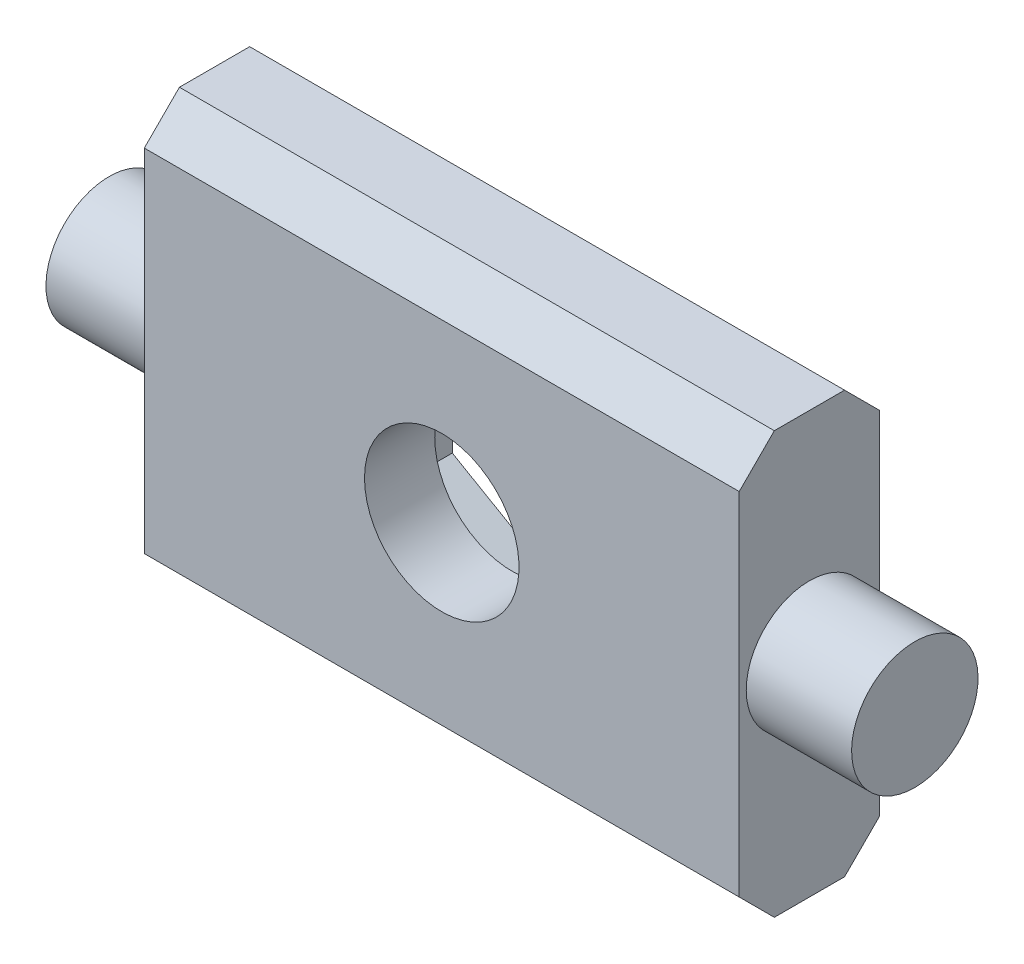
ISO-10303-21;
HEADER;
FILE_DESCRIPTION(('STEP AP214'),'2;1');
FILE_NAME('part.step','',(''),(''),'','','');
FILE_SCHEMA(('AUTOMOTIVE_DESIGN { 1 0 10303 214 1 1 1 1 }'));
ENDSEC;
DATA;
#1=APPLICATION_CONTEXT('core data for automotive mechanical design processes');
#2=APPLICATION_PROTOCOL_DEFINITION('international standard','automotive_design',2000,#1);
#3=PRODUCT_CONTEXT('',#1,'mechanical');
#4=PRODUCT('Part','Part','',(#3));
#5=PRODUCT_RELATED_PRODUCT_CATEGORY('part','',(#4));
#6=PRODUCT_DEFINITION_FORMATION('','',#4);
#7=PRODUCT_DEFINITION_CONTEXT('part definition',#1,'design');
#8=PRODUCT_DEFINITION('design','',#6,#7);
#9=PRODUCT_DEFINITION_SHAPE('','',#8);
#10=(LENGTH_UNIT() NAMED_UNIT(*) SI_UNIT(.MILLI.,.METRE.));
#11=(NAMED_UNIT(*) PLANE_ANGLE_UNIT() SI_UNIT($,.RADIAN.));
#12=(NAMED_UNIT(*) SI_UNIT($,.STERADIAN.) SOLID_ANGLE_UNIT());
#13=UNCERTAINTY_MEASURE_WITH_UNIT(LENGTH_MEASURE(1.E-05),#10,'distance_accuracy_value','');
#14=(GEOMETRIC_REPRESENTATION_CONTEXT(3) GLOBAL_UNCERTAINTY_ASSIGNED_CONTEXT((#13)) GLOBAL_UNIT_ASSIGNED_CONTEXT((#10,
#11,#12)) REPRESENTATION_CONTEXT('',''));
#15=CARTESIAN_POINT('',(0.,0.,0.));
#16=DIRECTION('',(0.,0.,1.));
#17=DIRECTION('',(1.,0.,0.));
#18=AXIS2_PLACEMENT_3D('',#15,#16,#17);
#19=CARTESIAN_POINT('',(0.,0.,4.));
#20=DIRECTION('',(0.,0.,1.));
#21=DIRECTION('',(1.,0.,0.));
#22=AXIS2_PLACEMENT_3D('',#19,#20,#21);
#23=PLANE('',#22);
#24=CARTESIAN_POINT('',(0.,0.,4.));
#25=DIRECTION('',(0.,0.,-1.));
#26=DIRECTION('',(-1.,0.,0.));
#27=AXIS2_PLACEMENT_3D('',#24,#25,#26);
#28=CIRCLE('',#27,2.2);
#29=CARTESIAN_POINT('',(-2.2,0.,4.));
#30=VERTEX_POINT('',#29);
#31=EDGE_CURVE('E231',#30,#30,#28,.T.);
#32=ORIENTED_EDGE('',*,*,#31,.T.);
#33=EDGE_LOOP('',(#32));
#34=FACE_BOUND('',#33,.T.);
#35=DIRECTION('',(0.,1.,0.));
#36=VECTOR('',#35,1.);
#37=CARTESIAN_POINT('',(-8.47,0.,4.));
#38=LINE('',#37,#36);
#39=CARTESIAN_POINT('',(-8.47,-5.,4.));
#40=VERTEX_POINT('',#39);
#41=CARTESIAN_POINT('',(-8.47,5.,4.));
#42=VERTEX_POINT('',#41);
#43=EDGE_CURVE('E251',#40,#42,#38,.T.);
#44=ORIENTED_EDGE('',*,*,#43,.F.);
#45=DIRECTION('',(1.,0.,0.));
#46=VECTOR('',#45,1.);
#47=CARTESIAN_POINT('',(8.47000000000001,-5.,4.));
#48=LINE('',#47,#46);
#49=CARTESIAN_POINT('',(8.47,-5.,4.));
#50=VERTEX_POINT('',#49);
#51=EDGE_CURVE('E280',#40,#50,#48,.T.);
#52=ORIENTED_EDGE('',*,*,#51,.T.);
#53=DIRECTION('',(0.,-1.,0.));
#54=VECTOR('',#53,1.);
#55=CARTESIAN_POINT('',(8.47,0.,4.));
#56=LINE('',#55,#54);
#57=CARTESIAN_POINT('',(8.47,5.,4.));
#58=VERTEX_POINT('',#57);
#59=EDGE_CURVE('E259',#58,#50,#56,.T.);
#60=ORIENTED_EDGE('',*,*,#59,.F.);
#61=DIRECTION('',(-1.,0.,0.));
#62=VECTOR('',#61,1.);
#63=CARTESIAN_POINT('',(-8.47,5.,4.));
#64=LINE('',#63,#62);
#65=EDGE_CURVE('E277',#58,#42,#64,.T.);
#66=ORIENTED_EDGE('',*,*,#65,.T.);
#67=EDGE_LOOP('',(#44,#52,#60,#66));
#68=FACE_BOUND('',#67,.T.);
#69=ADVANCED_FACE('F82',(#34,#68),#23,.T.);
#70=CARTESIAN_POINT('',(0.,0.,0.));
#71=DIRECTION('',(0.,0.,1.));
#72=DIRECTION('',(1.,0.,0.));
#73=AXIS2_PLACEMENT_3D('',#70,#71,#72);
#74=PLANE('',#73);
#75=DIRECTION('',(-0.866025403784438,0.5,0.));
#76=VECTOR('',#75,1.);
#77=CARTESIAN_POINT('',(0.,-4.27239199200323,0.));
#78=LINE('',#77,#76);
#79=CARTESIAN_POINT('',(0.,-4.27239199200323,0.));
#80=VERTEX_POINT('',#79);
#81=CARTESIAN_POINT('',(-3.7,-2.13619599600161,0.));
#82=VERTEX_POINT('',#81);
#83=EDGE_CURVE('E202',#80,#82,#78,.T.);
#84=ORIENTED_EDGE('',*,*,#83,.F.);
#85=DIRECTION('',(-0.866025403784439,-0.5,0.));
#86=VECTOR('',#85,1.);
#87=CARTESIAN_POINT('',(3.7,-2.13619599600161,0.));
#88=LINE('',#87,#86);
#89=CARTESIAN_POINT('',(3.7,-2.13619599600161,0.));
#90=VERTEX_POINT('',#89);
#91=EDGE_CURVE('E99',#90,#80,#88,.T.);
#92=ORIENTED_EDGE('',*,*,#91,.F.);
#93=DIRECTION('',(0.,-1.,0.));
#94=VECTOR('',#93,1.);
#95=CARTESIAN_POINT('',(3.7,2.13619599600162,0.));
#96=LINE('',#95,#94);
#97=CARTESIAN_POINT('',(3.7,2.13619599600162,0.));
#98=VERTEX_POINT('',#97);
#99=EDGE_CURVE('E218',#98,#90,#96,.T.);
#100=ORIENTED_EDGE('',*,*,#99,.F.);
#101=DIRECTION('',(0.866025403784439,-0.5,0.));
#102=VECTOR('',#101,1.);
#103=CARTESIAN_POINT('',(0.,4.27239199200323,0.));
#104=LINE('',#103,#102);
#105=CARTESIAN_POINT('',(0.,4.27239199200323,0.));
#106=VERTEX_POINT('',#105);
#107=EDGE_CURVE('E212',#106,#98,#104,.T.);
#108=ORIENTED_EDGE('',*,*,#107,.F.);
#109=DIRECTION('',(0.866025403784439,0.5,0.));
#110=VECTOR('',#109,1.);
#111=CARTESIAN_POINT('',(-3.7,2.13619599600162,0.));
#112=LINE('',#111,#110);
#113=CARTESIAN_POINT('',(-3.7,2.13619599600162,0.));
#114=VERTEX_POINT('',#113);
#115=EDGE_CURVE('E210',#114,#106,#112,.T.);
#116=ORIENTED_EDGE('',*,*,#115,.F.);
#117=DIRECTION('',(0.,1.,0.));
#118=VECTOR('',#117,1.);
#119=CARTESIAN_POINT('',(-3.7,-2.13619599600161,0.));
#120=LINE('',#119,#118);
#121=EDGE_CURVE('E192',#82,#114,#120,.T.);
#122=ORIENTED_EDGE('',*,*,#121,.F.);
#123=EDGE_LOOP('',(#84,#92,#100,#108,#116,#122));
#124=FACE_BOUND('',#123,.T.);
#125=DIRECTION('',(0.,1.,0.));
#126=VECTOR('',#125,1.);
#127=CARTESIAN_POINT('',(8.47,0.,0.));
#128=LINE('',#127,#126);
#129=CARTESIAN_POINT('',(8.47,-4.99999999999999,0.));
#130=VERTEX_POINT('',#129);
#131=CARTESIAN_POINT('',(8.47,5.,0.));
#132=VERTEX_POINT('',#131);
#133=EDGE_CURVE('E262',#130,#132,#128,.T.);
#134=ORIENTED_EDGE('',*,*,#133,.F.);
#135=DIRECTION('',(-1.,0.,0.));
#136=VECTOR('',#135,1.);
#137=CARTESIAN_POINT('',(0.,-4.99999999999999,0.));
#138=LINE('',#137,#136);
#139=CARTESIAN_POINT('',(-8.47,-4.99999999999999,0.));
#140=VERTEX_POINT('',#139);
#141=EDGE_CURVE('E298',#130,#140,#138,.T.);
#142=ORIENTED_EDGE('',*,*,#141,.T.);
#143=DIRECTION('',(0.,-1.,0.));
#144=VECTOR('',#143,1.);
#145=CARTESIAN_POINT('',(-8.47,0.,0.));
#146=LINE('',#145,#144);
#147=CARTESIAN_POINT('',(-8.47,5.,0.));
#148=VERTEX_POINT('',#147);
#149=EDGE_CURVE('E248',#148,#140,#146,.T.);
#150=ORIENTED_EDGE('',*,*,#149,.F.);
#151=DIRECTION('',(1.,0.,0.));
#152=VECTOR('',#151,1.);
#153=CARTESIAN_POINT('',(0.,5.,0.));
#154=LINE('',#153,#152);
#155=EDGE_CURVE('E273',#148,#132,#154,.T.);
#156=ORIENTED_EDGE('',*,*,#155,.T.);
#157=EDGE_LOOP('',(#134,#142,#150,#156));
#158=FACE_BOUND('',#157,.T.);
#159=ADVANCED_FACE('F206',(#124,#158),#74,.F.);
#160=CARTESIAN_POINT('',(-11.47,-6.,4.));
#161=DIRECTION('',(0.,1.,0.));
#162=DIRECTION('',(0.,0.,1.));
#163=AXIS2_PLACEMENT_3D('',#160,#161,#162);
#164=PLANE('',#163);
#165=DIRECTION('',(0.,0.,-1.));
#166=VECTOR('',#165,1.);
#167=CARTESIAN_POINT('',(8.47000000000001,-6.,0.));
#168=LINE('',#167,#166);
#169=CARTESIAN_POINT('',(8.47000000000001,-6.,2.99999999999999));
#170=VERTEX_POINT('',#169);
#171=CARTESIAN_POINT('',(8.47000000000001,-6.,1.));
#172=VERTEX_POINT('',#171);
#173=EDGE_CURVE('E256',#170,#172,#168,.T.);
#174=ORIENTED_EDGE('',*,*,#173,.F.);
#175=DIRECTION('',(-1.,0.,0.));
#176=VECTOR('',#175,1.);
#177=CARTESIAN_POINT('',(-8.47,-6.,2.99999999999999));
#178=LINE('',#177,#176);
#179=CARTESIAN_POINT('',(-8.47,-6.,2.99999999999999));
#180=VERTEX_POINT('',#179);
#181=EDGE_CURVE('E291',#170,#180,#178,.T.);
#182=ORIENTED_EDGE('',*,*,#181,.T.);
#183=DIRECTION('',(0.,0.,1.));
#184=VECTOR('',#183,1.);
#185=CARTESIAN_POINT('',(-8.47,-6.,0.));
#186=LINE('',#185,#184);
#187=CARTESIAN_POINT('',(-8.47,-6.,1.));
#188=VERTEX_POINT('',#187);
#189=EDGE_CURVE('E245',#188,#180,#186,.T.);
#190=ORIENTED_EDGE('',*,*,#189,.F.);
#191=DIRECTION('',(1.,0.,0.));
#192=VECTOR('',#191,1.);
#193=CARTESIAN_POINT('',(-11.47,-6.,1.));
#194=LINE('',#193,#192);
#195=EDGE_CURVE('E288',#188,#172,#194,.T.);
#196=ORIENTED_EDGE('',*,*,#195,.T.);
#197=EDGE_LOOP('',(#174,#182,#190,#196));
#198=FACE_BOUND('',#197,.T.);
#199=ADVANCED_FACE('F331',(#198),#164,.F.);
#200=CARTESIAN_POINT('',(-11.47,6.,4.));
#201=DIRECTION('',(0.,-1.,0.));
#202=DIRECTION('',(0.,0.,-1.));
#203=AXIS2_PLACEMENT_3D('',#200,#201,#202);
#204=PLANE('',#203);
#205=DIRECTION('',(0.,0.,-1.));
#206=VECTOR('',#205,1.);
#207=CARTESIAN_POINT('',(-8.47,6.,0.));
#208=LINE('',#207,#206);
#209=CARTESIAN_POINT('',(-8.47,6.,2.99999999999999));
#210=VERTEX_POINT('',#209);
#211=CARTESIAN_POINT('',(-8.47,6.,0.999999999999995));
#212=VERTEX_POINT('',#211);
#213=EDGE_CURVE('E254',#210,#212,#208,.T.);
#214=ORIENTED_EDGE('',*,*,#213,.F.);
#215=DIRECTION('',(1.,0.,0.));
#216=VECTOR('',#215,1.);
#217=CARTESIAN_POINT('',(8.47,6.,2.99999999999999));
#218=LINE('',#217,#216);
#219=CARTESIAN_POINT('',(8.47,6.,2.99999999999999));
#220=VERTEX_POINT('',#219);
#221=EDGE_CURVE('E91',#210,#220,#218,.T.);
#222=ORIENTED_EDGE('',*,*,#221,.T.);
#223=DIRECTION('',(0.,0.,1.));
#224=VECTOR('',#223,1.);
#225=CARTESIAN_POINT('',(8.47,6.,0.));
#226=LINE('',#225,#224);
#227=CARTESIAN_POINT('',(8.47,6.,0.999999999999996));
#228=VERTEX_POINT('',#227);
#229=EDGE_CURVE('E265',#228,#220,#226,.T.);
#230=ORIENTED_EDGE('',*,*,#229,.F.);
#231=DIRECTION('',(-1.,0.,0.));
#232=VECTOR('',#231,1.);
#233=CARTESIAN_POINT('',(-11.47,6.,0.999999999999994));
#234=LINE('',#233,#232);
#235=EDGE_CURVE('E267',#228,#212,#234,.T.);
#236=ORIENTED_EDGE('',*,*,#235,.T.);
#237=EDGE_LOOP('',(#214,#222,#230,#236));
#238=FACE_BOUND('',#237,.T.);
#239=ADVANCED_FACE('F340',(#238),#204,.F.);
#240=CARTESIAN_POINT('',(8.47,0.,0.));
#241=DIRECTION('',(1.,0.,0.));
#242=DIRECTION('',(0.,1.,0.));
#243=AXIS2_PLACEMENT_3D('',#240,#241,#242);
#244=PLANE('',#243);
#245=ORIENTED_EDGE('',*,*,#229,.T.);
#246=DIRECTION('',(0.,-0.707106781186545,0.70710678118655));
#247=VECTOR('',#246,1.);
#248=CARTESIAN_POINT('',(8.47,4.50000000000002,4.49999999999998));
#249=LINE('',#248,#247);
#250=EDGE_CURVE('E12',#220,#58,#249,.T.);
#251=ORIENTED_EDGE('',*,*,#250,.T.);
#252=ORIENTED_EDGE('',*,*,#59,.T.);
#253=DIRECTION('',(0.,-0.707106781186545,-0.70710678118655));
#254=VECTOR('',#253,1.);
#255=CARTESIAN_POINT('',(8.47,-4.50000000000001,4.49999999999999));
#256=LINE('',#255,#254);
#257=EDGE_CURVE('E286',#50,#170,#256,.T.);
#258=ORIENTED_EDGE('',*,*,#257,.T.);
#259=ORIENTED_EDGE('',*,*,#173,.T.);
#260=DIRECTION('',(0.,-0.70710678118655,0.707106781186545));
#261=VECTOR('',#260,1.);
#262=CARTESIAN_POINT('',(8.47,-2.49999999999998,-2.5));
#263=LINE('',#262,#261);
#264=EDGE_CURVE('E283',#172,#130,#263,.F.);
#265=ORIENTED_EDGE('',*,*,#264,.T.);
#266=ORIENTED_EDGE('',*,*,#133,.T.);
#267=DIRECTION('',(0.,-0.70710678118655,-0.707106781186545));
#268=VECTOR('',#267,1.);
#269=CARTESIAN_POINT('',(8.47,2.49999999999998,-2.5));
#270=LINE('',#269,#268);
#271=EDGE_CURVE('E275',#132,#228,#270,.F.);
#272=ORIENTED_EDGE('',*,*,#271,.T.);
#273=EDGE_LOOP('',(#245,#251,#252,#258,#259,#265,#266,#272));
#274=FACE_BOUND('',#273,.T.);
#275=CARTESIAN_POINT('',(8.47,0.,2.));
#276=DIRECTION('',(1.,0.,0.));
#277=DIRECTION('',(0.,1.,0.));
#278=AXIS2_PLACEMENT_3D('',#275,#276,#277);
#279=CIRCLE('',#278,1.8);
#280=CARTESIAN_POINT('',(8.47,1.8,2.));
#281=VERTEX_POINT('',#280);
#282=EDGE_CURVE('E238',#281,#281,#279,.T.);
#283=ORIENTED_EDGE('',*,*,#282,.F.);
#284=EDGE_LOOP('',(#283));
#285=FACE_BOUND('',#284,.T.);
#286=ADVANCED_FACE('F335',(#274,#285),#244,.T.);
#287=CARTESIAN_POINT('',(-8.47,0.,0.));
#288=DIRECTION('',(-1.,0.,0.));
#289=DIRECTION('',(0.,-1.,0.));
#290=AXIS2_PLACEMENT_3D('',#287,#288,#289);
#291=PLANE('',#290);
#292=ORIENTED_EDGE('',*,*,#43,.T.);
#293=DIRECTION('',(0.,0.707106781186545,-0.70710678118655));
#294=VECTOR('',#293,1.);
#295=CARTESIAN_POINT('',(-8.47,4.50000000000001,4.49999999999999));
#296=LINE('',#295,#294);
#297=EDGE_CURVE('E300',#42,#210,#296,.T.);
#298=ORIENTED_EDGE('',*,*,#297,.T.);
#299=ORIENTED_EDGE('',*,*,#213,.T.);
#300=DIRECTION('',(0.,0.70710678118655,0.707106781186545));
#301=VECTOR('',#300,1.);
#302=CARTESIAN_POINT('',(-8.47,2.49999999999998,-2.5));
#303=LINE('',#302,#301);
#304=EDGE_CURVE('E270',#212,#148,#303,.F.);
#305=ORIENTED_EDGE('',*,*,#304,.T.);
#306=ORIENTED_EDGE('',*,*,#149,.T.);
#307=DIRECTION('',(0.,0.70710678118655,-0.707106781186545));
#308=VECTOR('',#307,1.);
#309=CARTESIAN_POINT('',(-8.47,-2.49999999999998,-2.49999999999999));
#310=LINE('',#309,#308);
#311=EDGE_CURVE('E293',#140,#188,#310,.F.);
#312=ORIENTED_EDGE('',*,*,#311,.T.);
#313=ORIENTED_EDGE('',*,*,#189,.T.);
#314=DIRECTION('',(0.,0.707106781186545,0.70710678118655));
#315=VECTOR('',#314,1.);
#316=CARTESIAN_POINT('',(-8.47,-4.50000000000002,4.49999999999998));
#317=LINE('',#316,#315);
#318=EDGE_CURVE('E295',#180,#40,#317,.T.);
#319=ORIENTED_EDGE('',*,*,#318,.T.);
#320=EDGE_LOOP('',(#292,#298,#299,#305,#306,#312,#313,#319));
#321=FACE_BOUND('',#320,.T.);
#322=CARTESIAN_POINT('',(-8.47,0.,2.));
#323=DIRECTION('',(-1.,0.,0.));
#324=DIRECTION('',(0.,-1.,0.));
#325=AXIS2_PLACEMENT_3D('',#322,#323,#324);
#326=CIRCLE('',#325,1.8);
#327=CARTESIAN_POINT('',(-8.47,-1.8,2.));
#328=VERTEX_POINT('',#327);
#329=EDGE_CURVE('E235',#328,#328,#326,.T.);
#330=ORIENTED_EDGE('',*,*,#329,.F.);
#331=EDGE_LOOP('',(#330));
#332=FACE_BOUND('',#331,.T.);
#333=ADVANCED_FACE('F365',(#321,#332),#291,.T.);
#334=CARTESIAN_POINT('',(0.,0.,2.));
#335=DIRECTION('',(0.,0.,-1.));
#336=DIRECTION('',(-1.,0.,0.));
#337=AXIS2_PLACEMENT_3D('',#334,#335,#336);
#338=PLANE('',#337);
#339=CARTESIAN_POINT('',(0.,0.,2.));
#340=DIRECTION('',(0.,0.,-1.));
#341=DIRECTION('',(-1.,0.,0.));
#342=AXIS2_PLACEMENT_3D('',#339,#340,#341);
#343=CIRCLE('',#342,2.2);
#344=CARTESIAN_POINT('',(-2.2,0.,2.));
#345=VERTEX_POINT('',#344);
#346=EDGE_CURVE('E86',#345,#345,#343,.T.);
#347=ORIENTED_EDGE('',*,*,#346,.F.);
#348=EDGE_LOOP('',(#347));
#349=FACE_BOUND('',#348,.T.);
#350=DIRECTION('',(0.866025403784439,0.5,0.));
#351=VECTOR('',#350,1.);
#352=CARTESIAN_POINT('',(3.7,-2.13619599600161,2.));
#353=LINE('',#352,#351);
#354=CARTESIAN_POINT('',(0.,-4.27239199200323,2.));
#355=VERTEX_POINT('',#354);
#356=CARTESIAN_POINT('',(3.7,-2.13619599600162,2.));
#357=VERTEX_POINT('',#356);
#358=EDGE_CURVE('E232',#355,#357,#353,.T.);
#359=ORIENTED_EDGE('',*,*,#358,.F.);
#360=DIRECTION('',(0.866025403784438,-0.5,0.));
#361=VECTOR('',#360,1.);
#362=CARTESIAN_POINT('',(0.,-4.27239199200323,2.));
#363=LINE('',#362,#361);
#364=CARTESIAN_POINT('',(-3.7,-2.13619599600161,2.));
#365=VERTEX_POINT('',#364);
#366=EDGE_CURVE('E229',#365,#355,#363,.T.);
#367=ORIENTED_EDGE('',*,*,#366,.F.);
#368=DIRECTION('',(0.,-1.,0.));
#369=VECTOR('',#368,1.);
#370=CARTESIAN_POINT('',(-3.7,-2.13619599600161,2.));
#371=LINE('',#370,#369);
#372=CARTESIAN_POINT('',(-3.7,2.13619599600162,2.));
#373=VERTEX_POINT('',#372);
#374=EDGE_CURVE('E195',#373,#365,#371,.T.);
#375=ORIENTED_EDGE('',*,*,#374,.F.);
#376=DIRECTION('',(-0.866025403784439,-0.5,0.));
#377=VECTOR('',#376,1.);
#378=CARTESIAN_POINT('',(-3.7,2.13619599600162,2.));
#379=LINE('',#378,#377);
#380=CARTESIAN_POINT('',(0.,4.27239199200323,2.));
#381=VERTEX_POINT('',#380);
#382=EDGE_CURVE('E481',#381,#373,#379,.T.);
#383=ORIENTED_EDGE('',*,*,#382,.F.);
#384=DIRECTION('',(-0.866025403784439,0.5,0.));
#385=VECTOR('',#384,1.);
#386=CARTESIAN_POINT('',(0.,4.27239199200323,2.));
#387=LINE('',#386,#385);
#388=CARTESIAN_POINT('',(3.7,2.13619599600162,2.));
#389=VERTEX_POINT('',#388);
#390=EDGE_CURVE('E482',#389,#381,#387,.T.);
#391=ORIENTED_EDGE('',*,*,#390,.F.);
#392=DIRECTION('',(0.,1.,0.));
#393=VECTOR('',#392,1.);
#394=CARTESIAN_POINT('',(3.7,2.13619599600162,2.));
#395=LINE('',#394,#393);
#396=EDGE_CURVE('E396',#357,#389,#395,.T.);
#397=ORIENTED_EDGE('',*,*,#396,.F.);
#398=EDGE_LOOP('',(#359,#367,#375,#383,#391,#397));
#399=FACE_BOUND('',#398,.T.);
#400=ADVANCED_FACE('F352',(#349,#399),#338,.T.);
#401=CARTESIAN_POINT('',(-11.47,6.,0.999999999999994));
#402=DIRECTION('',(0.,-0.707106781186545,0.70710678118655));
#403=DIRECTION('',(-1.,0.,0.));
#404=AXIS2_PLACEMENT_3D('',#401,#402,#403);
#405=PLANE('',#404);
#406=ORIENTED_EDGE('',*,*,#271,.F.);
#407=ORIENTED_EDGE('',*,*,#155,.F.);
#408=ORIENTED_EDGE('',*,*,#304,.F.);
#409=ORIENTED_EDGE('',*,*,#235,.F.);
#410=EDGE_LOOP('',(#406,#407,#408,#409));
#411=FACE_BOUND('',#410,.T.);
#412=ADVANCED_FACE('F348',(#411),#405,.F.);
#413=CARTESIAN_POINT('',(0.,-5.,4.));
#414=DIRECTION('',(0.,-0.70710678118655,0.707106781186545));
#415=DIRECTION('',(-1.,0.,0.));
#416=AXIS2_PLACEMENT_3D('',#413,#414,#415);
#417=PLANE('',#416);
#418=ORIENTED_EDGE('',*,*,#318,.F.);
#419=ORIENTED_EDGE('',*,*,#181,.F.);
#420=ORIENTED_EDGE('',*,*,#257,.F.);
#421=ORIENTED_EDGE('',*,*,#51,.F.);
#422=EDGE_LOOP('',(#418,#419,#420,#421));
#423=FACE_BOUND('',#422,.T.);
#424=ADVANCED_FACE('F351',(#423),#417,.T.);
#425=CARTESIAN_POINT('',(-11.47,-6.,1.));
#426=DIRECTION('',(0.,0.707106781186545,0.70710678118655));
#427=DIRECTION('',(1.,0.,0.));
#428=AXIS2_PLACEMENT_3D('',#425,#426,#427);
#429=PLANE('',#428);
#430=ORIENTED_EDGE('',*,*,#311,.F.);
#431=ORIENTED_EDGE('',*,*,#141,.F.);
#432=ORIENTED_EDGE('',*,*,#264,.F.);
#433=ORIENTED_EDGE('',*,*,#195,.F.);
#434=EDGE_LOOP('',(#430,#431,#432,#433));
#435=FACE_BOUND('',#434,.T.);
#436=ADVANCED_FACE('F319',(#435),#429,.F.);
#437=CARTESIAN_POINT('',(0.,5.,4.));
#438=DIRECTION('',(0.,0.70710678118655,0.707106781186545));
#439=DIRECTION('',(1.,0.,0.));
#440=AXIS2_PLACEMENT_3D('',#437,#438,#439);
#441=PLANE('',#440);
#442=ORIENTED_EDGE('',*,*,#250,.F.);
#443=ORIENTED_EDGE('',*,*,#221,.F.);
#444=ORIENTED_EDGE('',*,*,#297,.F.);
#445=ORIENTED_EDGE('',*,*,#65,.F.);
#446=EDGE_LOOP('',(#442,#443,#444,#445));
#447=FACE_BOUND('',#446,.T.);
#448=ADVANCED_FACE('F84',(#447),#441,.T.);
#449=CARTESIAN_POINT('',(18.47,0.,2.));
#450=DIRECTION('',(-1.,0.,0.));
#451=DIRECTION('',(0.,-1.,0.));
#452=AXIS2_PLACEMENT_3D('',#449,#450,#451);
#453=CYLINDRICAL_SURFACE('',#452,1.8);
#454=ORIENTED_EDGE('',*,*,#282,.T.);
#455=EDGE_LOOP('',(#454));
#456=FACE_BOUND('',#455,.T.);
#457=CARTESIAN_POINT('',(11.47,0.,2.));
#458=DIRECTION('',(-1.,0.,0.));
#459=DIRECTION('',(0.,-1.,0.));
#460=AXIS2_PLACEMENT_3D('',#457,#458,#459);
#461=CIRCLE('',#460,1.8);
#462=CARTESIAN_POINT('',(11.47,-1.8,2.));
#463=VERTEX_POINT('',#462);
#464=EDGE_CURVE('E244',#463,#463,#461,.F.);
#465=ORIENTED_EDGE('',*,*,#464,.F.);
#466=EDGE_LOOP('',(#465));
#467=FACE_BOUND('',#466,.T.);
#468=ADVANCED_FACE('F307',(#456,#467),#453,.T.);
#469=CARTESIAN_POINT('',(11.47,6.,4.));
#470=DIRECTION('',(-1.,0.,0.));
#471=DIRECTION('',(0.,-1.,0.));
#472=AXIS2_PLACEMENT_3D('',#469,#470,#471);
#473=PLANE('',#472);
#474=ORIENTED_EDGE('',*,*,#464,.T.);
#475=EDGE_LOOP('',(#474));
#476=FACE_BOUND('',#475,.T.);
#477=ADVANCED_FACE('F305',(#476),#473,.F.);
#478=CARTESIAN_POINT('',(-8.47,0.,2.));
#479=DIRECTION('',(-1.,0.,0.));
#480=DIRECTION('',(0.,-1.,0.));
#481=AXIS2_PLACEMENT_3D('',#478,#479,#480);
#482=CYLINDRICAL_SURFACE('',#481,1.8);
#483=ORIENTED_EDGE('',*,*,#329,.T.);
#484=EDGE_LOOP('',(#483));
#485=FACE_BOUND('',#484,.T.);
#486=CARTESIAN_POINT('',(-11.47,0.,2.));
#487=DIRECTION('',(-1.,0.,0.));
#488=DIRECTION('',(0.,-1.,0.));
#489=AXIS2_PLACEMENT_3D('',#486,#487,#488);
#490=CIRCLE('',#489,1.8);
#491=CARTESIAN_POINT('',(-11.47,-1.8,2.));
#492=VERTEX_POINT('',#491);
#493=EDGE_CURVE('E239',#492,#492,#490,.T.);
#494=ORIENTED_EDGE('',*,*,#493,.F.);
#495=EDGE_LOOP('',(#494));
#496=FACE_BOUND('',#495,.T.);
#497=ADVANCED_FACE('F316',(#485,#496),#482,.T.);
#498=CARTESIAN_POINT('',(-11.47,6.,4.));
#499=DIRECTION('',(1.,0.,0.));
#500=DIRECTION('',(0.,1.,0.));
#501=AXIS2_PLACEMENT_3D('',#498,#499,#500);
#502=PLANE('',#501);
#503=ORIENTED_EDGE('',*,*,#493,.T.);
#504=EDGE_LOOP('',(#503));
#505=FACE_BOUND('',#504,.T.);
#506=ADVANCED_FACE('F342',(#505),#502,.F.);
#507=CARTESIAN_POINT('',(0.,0.,4.));
#508=DIRECTION('',(0.,0.,-1.));
#509=DIRECTION('',(-1.,0.,0.));
#510=AXIS2_PLACEMENT_3D('',#507,#508,#509);
#511=CYLINDRICAL_SURFACE('',#510,2.2);
#512=ORIENTED_EDGE('',*,*,#346,.T.);
#513=EDGE_LOOP('',(#512));
#514=FACE_BOUND('',#513,.T.);
#515=ORIENTED_EDGE('',*,*,#31,.F.);
#516=EDGE_LOOP('',(#515));
#517=FACE_BOUND('',#516,.T.);
#518=ADVANCED_FACE('F344',(#514,#517),#511,.F.);
#519=CARTESIAN_POINT('',(3.7,-2.13619599600161,13.3036867142244));
#520=DIRECTION('',(0.5,-0.866025403784438,0.));
#521=DIRECTION('',(0.866025403784439,0.5,0.));
#522=AXIS2_PLACEMENT_3D('',#519,#520,#521);
#523=PLANE('',#522);
#524=ORIENTED_EDGE('',*,*,#358,.T.);
#525=DIRECTION('',(0.,0.,-1.));
#526=VECTOR('',#525,1.);
#527=CARTESIAN_POINT('',(3.7,-2.13619599600161,13.3036867142244));
#528=LINE('',#527,#526);
#529=EDGE_CURVE('E221',#357,#90,#528,.T.);
#530=ORIENTED_EDGE('',*,*,#529,.T.);
#531=ORIENTED_EDGE('',*,*,#91,.T.);
#532=DIRECTION('',(0.,0.,-1.));
#533=VECTOR('',#532,1.);
#534=CARTESIAN_POINT('',(0.,-4.27239199200323,13.3036867142244));
#535=LINE('',#534,#533);
#536=EDGE_CURVE('E199',#355,#80,#535,.T.);
#537=ORIENTED_EDGE('',*,*,#536,.F.);
#538=EDGE_LOOP('',(#524,#530,#531,#537));
#539=FACE_BOUND('',#538,.T.);
#540=ADVANCED_FACE('F399',(#539),#523,.F.);
#541=CARTESIAN_POINT('',(3.7,2.13619599600162,13.3036867142244));
#542=DIRECTION('',(1.,0.,0.));
#543=DIRECTION('',(0.,0.,-1.));
#544=AXIS2_PLACEMENT_3D('',#541,#542,#543);
#545=PLANE('',#544);
#546=ORIENTED_EDGE('',*,*,#396,.T.);
#547=DIRECTION('',(0.,0.,-1.));
#548=VECTOR('',#547,1.);
#549=CARTESIAN_POINT('',(3.7,2.13619599600162,13.3036867142244));
#550=LINE('',#549,#548);
#551=EDGE_CURVE('E223',#389,#98,#550,.T.);
#552=ORIENTED_EDGE('',*,*,#551,.T.);
#553=ORIENTED_EDGE('',*,*,#99,.T.);
#554=ORIENTED_EDGE('',*,*,#529,.F.);
#555=EDGE_LOOP('',(#546,#552,#553,#554));
#556=FACE_BOUND('',#555,.T.);
#557=ADVANCED_FACE('F401',(#556),#545,.F.);
#558=CARTESIAN_POINT('',(0.,4.27239199200323,13.3036867142244));
#559=DIRECTION('',(0.5,0.866025403784439,0.));
#560=DIRECTION('',(-0.866025403784439,0.5,0.));
#561=AXIS2_PLACEMENT_3D('',#558,#559,#560);
#562=PLANE('',#561);
#563=ORIENTED_EDGE('',*,*,#390,.T.);
#564=DIRECTION('',(0.,0.,-1.));
#565=VECTOR('',#564,1.);
#566=CARTESIAN_POINT('',(0.,4.27239199200323,13.3036867142244));
#567=LINE('',#566,#565);
#568=EDGE_CURVE('E225',#381,#106,#567,.T.);
#569=ORIENTED_EDGE('',*,*,#568,.T.);
#570=ORIENTED_EDGE('',*,*,#107,.T.);
#571=ORIENTED_EDGE('',*,*,#551,.F.);
#572=EDGE_LOOP('',(#563,#569,#570,#571));
#573=FACE_BOUND('',#572,.T.);
#574=ADVANCED_FACE('F407',(#573),#562,.F.);
#575=CARTESIAN_POINT('',(-3.7,2.13619599600162,13.3036867142244));
#576=DIRECTION('',(-0.5,0.866025403784439,0.));
#577=DIRECTION('',(-0.866025403784439,-0.5,0.));
#578=AXIS2_PLACEMENT_3D('',#575,#576,#577);
#579=PLANE('',#578);
#580=ORIENTED_EDGE('',*,*,#382,.T.);
#581=DIRECTION('',(0.,0.,-1.));
#582=VECTOR('',#581,1.);
#583=CARTESIAN_POINT('',(-3.7,2.13619599600162,13.3036867142244));
#584=LINE('',#583,#582);
#585=EDGE_CURVE('E198',#373,#114,#584,.T.);
#586=ORIENTED_EDGE('',*,*,#585,.T.);
#587=ORIENTED_EDGE('',*,*,#115,.T.);
#588=ORIENTED_EDGE('',*,*,#568,.F.);
#589=EDGE_LOOP('',(#580,#586,#587,#588));
#590=FACE_BOUND('',#589,.T.);
#591=ADVANCED_FACE('F451',(#590),#579,.F.);
#592=CARTESIAN_POINT('',(-3.7,-2.13619599600161,13.3036867142244));
#593=DIRECTION('',(-1.,0.,0.));
#594=DIRECTION('',(0.,0.,1.));
#595=AXIS2_PLACEMENT_3D('',#592,#593,#594);
#596=PLANE('',#595);
#597=ORIENTED_EDGE('',*,*,#374,.T.);
#598=DIRECTION('',(0.,0.,-1.));
#599=VECTOR('',#598,1.);
#600=CARTESIAN_POINT('',(-3.7,-2.13619599600161,13.3036867142244));
#601=LINE('',#600,#599);
#602=EDGE_CURVE('E187',#365,#82,#601,.T.);
#603=ORIENTED_EDGE('',*,*,#602,.T.);
#604=ORIENTED_EDGE('',*,*,#121,.T.);
#605=ORIENTED_EDGE('',*,*,#585,.F.);
#606=EDGE_LOOP('',(#597,#603,#604,#605));
#607=FACE_BOUND('',#606,.T.);
#608=ADVANCED_FACE('F189',(#607),#596,.F.);
#609=CARTESIAN_POINT('',(0.,-4.27239199200323,13.3036867142244));
#610=DIRECTION('',(-0.5,-0.866025403784438,0.));
#611=DIRECTION('',(0.866025403784438,-0.5,0.));
#612=AXIS2_PLACEMENT_3D('',#609,#610,#611);
#613=PLANE('',#612);
#614=ORIENTED_EDGE('',*,*,#366,.T.);
#615=ORIENTED_EDGE('',*,*,#536,.T.);
#616=ORIENTED_EDGE('',*,*,#83,.T.);
#617=ORIENTED_EDGE('',*,*,#602,.F.);
#618=EDGE_LOOP('',(#614,#615,#616,#617));
#619=FACE_BOUND('',#618,.T.);
#620=ADVANCED_FACE('F203',(#619),#613,.F.);
#621=CLOSED_SHELL('',(#69,#159,#199,#239,#286,#333,#400,#412,#424,#436,#448,#468,#477,#497,#506,
#518,#540,#557,#574,#591,#608,#620));
#622=MANIFOLD_SOLID_BREP('B2',#621);
#623=ADVANCED_BREP_SHAPE_REPRESENTATION('',(#18,#622),#14);
#624=SHAPE_DEFINITION_REPRESENTATION(#9,#623);
ENDSEC;
END-ISO-10303-21;
